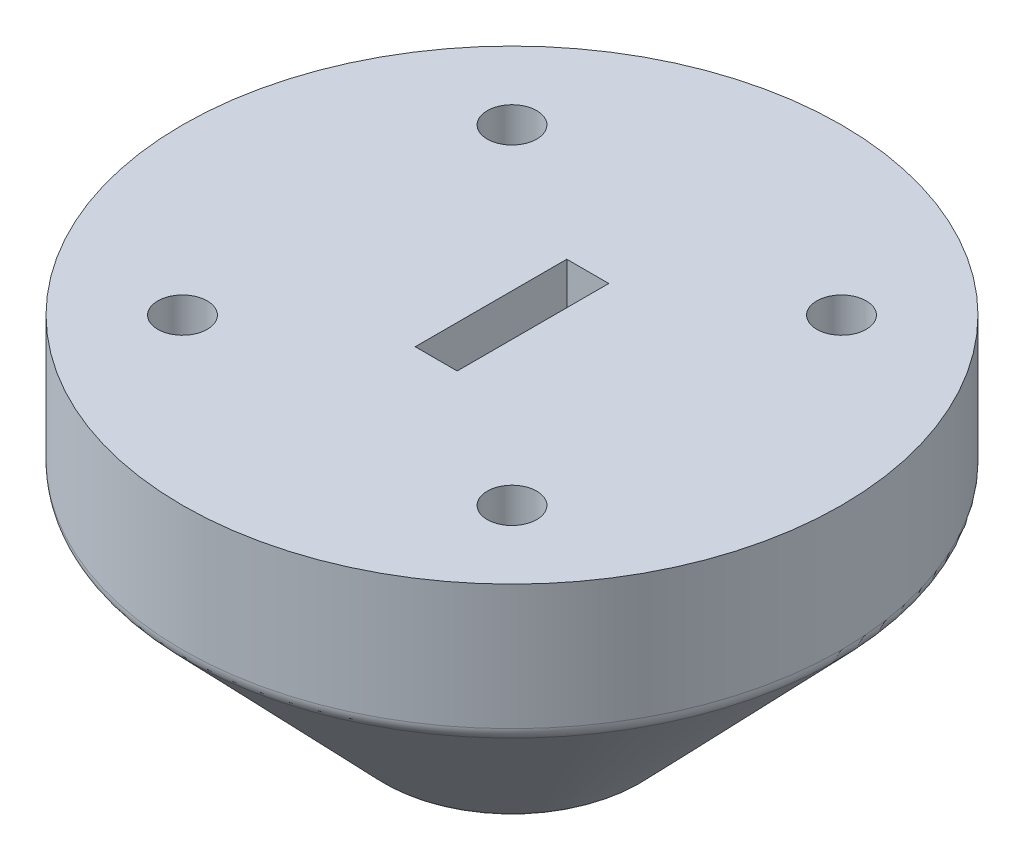
ISO-10303-21;
HEADER;
FILE_DESCRIPTION(('STEP AP214'),'2;1');
FILE_NAME('part.step','',(''),(''),'','','');
FILE_SCHEMA(('AUTOMOTIVE_DESIGN { 1 0 10303 214 1 1 1 1 }'));
ENDSEC;
DATA;
#1=APPLICATION_CONTEXT('core data for automotive mechanical design processes');
#2=APPLICATION_PROTOCOL_DEFINITION('international standard','automotive_design',2000,#1);
#3=PRODUCT_CONTEXT('',#1,'mechanical');
#4=PRODUCT('Part','Part','',(#3));
#5=PRODUCT_RELATED_PRODUCT_CATEGORY('part','',(#4));
#6=PRODUCT_DEFINITION_FORMATION('','',#4);
#7=PRODUCT_DEFINITION_CONTEXT('part definition',#1,'design');
#8=PRODUCT_DEFINITION('design','',#6,#7);
#9=PRODUCT_DEFINITION_SHAPE('','',#8);
#10=(LENGTH_UNIT() NAMED_UNIT(*) SI_UNIT(.MILLI.,.METRE.));
#11=(NAMED_UNIT(*) PLANE_ANGLE_UNIT() SI_UNIT($,.RADIAN.));
#12=(NAMED_UNIT(*) SI_UNIT($,.STERADIAN.) SOLID_ANGLE_UNIT());
#13=UNCERTAINTY_MEASURE_WITH_UNIT(LENGTH_MEASURE(1.E-05),#10,'distance_accuracy_value','');
#14=(GEOMETRIC_REPRESENTATION_CONTEXT(3) GLOBAL_UNCERTAINTY_ASSIGNED_CONTEXT((#13)) GLOBAL_UNIT_ASSIGNED_CONTEXT((#10,
#11,#12)) REPRESENTATION_CONTEXT('',''));
#15=CARTESIAN_POINT('',(0.,0.,0.));
#16=DIRECTION('',(0.,0.,1.));
#17=DIRECTION('',(1.,0.,0.));
#18=AXIS2_PLACEMENT_3D('',#15,#16,#17);
#19=CARTESIAN_POINT('',(0.,0.,-9.2));
#20=DIRECTION('',(0.,0.,-1.));
#21=DIRECTION('',(-1.,0.,0.));
#22=AXIS2_PLACEMENT_3D('',#19,#20,#21);
#23=PLANE('',#22);
#24=DIRECTION('',(0.0772683010231386,-0.997010335782432,0.));
#25=VECTOR('',#24,1.);
#26=CARTESIAN_POINT('',(-2.55,-20.,-9.2));
#27=LINE('',#26,#25);
#28=CARTESIAN_POINT('',(-2.55,-20.,-9.2));
#29=VERTEX_POINT('',#28);
#30=CARTESIAN_POINT('',(-2.23999999999999,-24.,-9.19999999999992));
#31=VERTEX_POINT('',#30);
#32=EDGE_CURVE('E263',#29,#31,#27,.T.);
#33=ORIENTED_EDGE('',*,*,#32,.T.);
#34=DIRECTION('',(1.,0.,0.));
#35=VECTOR('',#34,1.);
#36=CARTESIAN_POINT('',(0.,-24.0000000000001,-9.2));
#37=LINE('',#36,#35);
#38=CARTESIAN_POINT('',(2.24,-24.,-9.19999999999992));
#39=VERTEX_POINT('',#38);
#40=EDGE_CURVE('E137',#31,#39,#37,.T.);
#41=ORIENTED_EDGE('',*,*,#40,.T.);
#42=DIRECTION('',(0.0772683010231384,0.997010335782432,0.));
#43=VECTOR('',#42,1.);
#44=CARTESIAN_POINT('',(2.55,-20.,-9.2));
#45=LINE('',#44,#43);
#46=CARTESIAN_POINT('',(2.55,-20.,-9.2));
#47=VERTEX_POINT('',#46);
#48=EDGE_CURVE('E150',#39,#47,#45,.T.);
#49=ORIENTED_EDGE('',*,*,#48,.T.);
#50=DIRECTION('',(0.,1.,0.));
#51=VECTOR('',#50,1.);
#52=CARTESIAN_POINT('',(2.55,0.,-9.2));
#53=LINE('',#52,#51);
#54=CARTESIAN_POINT('',(2.55,0.,-9.2));
#55=VERTEX_POINT('',#54);
#56=EDGE_CURVE('E149',#47,#55,#53,.T.);
#57=ORIENTED_EDGE('',*,*,#56,.T.);
#58=DIRECTION('',(-1.,0.,0.));
#59=VECTOR('',#58,1.);
#60=CARTESIAN_POINT('',(-2.55,0.,-9.2));
#61=LINE('',#60,#59);
#62=CARTESIAN_POINT('',(-2.55,0.,-9.2));
#63=VERTEX_POINT('',#62);
#64=EDGE_CURVE('E152',#55,#63,#61,.T.);
#65=ORIENTED_EDGE('',*,*,#64,.T.);
#66=DIRECTION('',(0.,-1.,0.));
#67=VECTOR('',#66,1.);
#68=CARTESIAN_POINT('',(-2.55,0.,-9.2));
#69=LINE('',#68,#67);
#70=EDGE_CURVE('E260',#63,#29,#69,.T.);
#71=ORIENTED_EDGE('',*,*,#70,.T.);
#72=EDGE_LOOP('',(#33,#41,#49,#57,#65,#71));
#73=FACE_BOUND('',#72,.T.);
#74=ADVANCED_FACE('F32',(#73),#23,.F.);
#75=CARTESIAN_POINT('',(0.,0.,0.));
#76=DIRECTION('',(0.,1.,0.));
#77=DIRECTION('',(0.,0.,1.));
#78=AXIS2_PLACEMENT_3D('',#75,#76,#77);
#79=PLANE('',#78);
#80=CARTESIAN_POINT('',(20.,0.,20.));
#81=DIRECTION('',(0.,1.,0.));
#82=DIRECTION('',(0.,0.,1.));
#83=AXIS2_PLACEMENT_3D('',#80,#81,#82);
#84=CIRCLE('',#83,3.);
#85=CARTESIAN_POINT('',(20.,0.,23.));
#86=VERTEX_POINT('',#85);
#87=EDGE_CURVE('E186',#86,#86,#84,.T.);
#88=ORIENTED_EDGE('',*,*,#87,.F.);
#89=EDGE_LOOP('',(#88));
#90=FACE_BOUND('',#89,.T.);
#91=CARTESIAN_POINT('',(-20.,0.,-20.));
#92=DIRECTION('',(0.,1.,0.));
#93=DIRECTION('',(0.,0.,1.));
#94=AXIS2_PLACEMENT_3D('',#91,#92,#93);
#95=CIRCLE('',#94,3.);
#96=CARTESIAN_POINT('',(-20.,0.,-17.));
#97=VERTEX_POINT('',#96);
#98=EDGE_CURVE('E192',#97,#97,#95,.T.);
#99=ORIENTED_EDGE('',*,*,#98,.F.);
#100=EDGE_LOOP('',(#99));
#101=FACE_BOUND('',#100,.T.);
#102=CARTESIAN_POINT('',(-20.,0.,20.));
#103=DIRECTION('',(0.,1.,0.));
#104=DIRECTION('',(0.,0.,1.));
#105=AXIS2_PLACEMENT_3D('',#102,#103,#104);
#106=CIRCLE('',#105,3.);
#107=CARTESIAN_POINT('',(-20.,0.,23.));
#108=VERTEX_POINT('',#107);
#109=EDGE_CURVE('E198',#108,#108,#106,.T.);
#110=ORIENTED_EDGE('',*,*,#109,.F.);
#111=EDGE_LOOP('',(#110));
#112=FACE_BOUND('',#111,.T.);
#113=CARTESIAN_POINT('',(20.,0.,-20.));
#114=DIRECTION('',(0.,1.,0.));
#115=DIRECTION('',(0.,0.,1.));
#116=AXIS2_PLACEMENT_3D('',#113,#114,#115);
#117=CIRCLE('',#116,3.);
#118=CARTESIAN_POINT('',(20.,0.,-17.));
#119=VERTEX_POINT('',#118);
#120=EDGE_CURVE('E204',#119,#119,#117,.T.);
#121=ORIENTED_EDGE('',*,*,#120,.F.);
#122=EDGE_LOOP('',(#121));
#123=FACE_BOUND('',#122,.T.);
#124=CARTESIAN_POINT('',(0.,0.,0.));
#125=DIRECTION('',(0.,-1.,0.));
#126=DIRECTION('',(0.,0.,-1.));
#127=AXIS2_PLACEMENT_3D('',#124,#125,#126);
#128=CIRCLE('',#127,40.);
#129=CARTESIAN_POINT('',(0.,0.,-40.));
#130=VERTEX_POINT('',#129);
#131=EDGE_CURVE('E210',#130,#130,#128,.T.);
#132=ORIENTED_EDGE('',*,*,#131,.F.);
#133=EDGE_LOOP('',(#132));
#134=FACE_BOUND('',#133,.T.);
#135=DIRECTION('',(0.,0.,-1.));
#136=VECTOR('',#135,1.);
#137=CARTESIAN_POINT('',(2.55,0.,9.2));
#138=LINE('',#137,#136);
#139=CARTESIAN_POINT('',(2.55,0.,9.2));
#140=VERTEX_POINT('',#139);
#141=EDGE_CURVE('E178',#140,#55,#138,.T.);
#142=ORIENTED_EDGE('',*,*,#141,.F.);
#143=DIRECTION('',(-1.,0.,0.));
#144=VECTOR('',#143,1.);
#145=CARTESIAN_POINT('',(-2.55,0.,9.2));
#146=LINE('',#145,#144);
#147=CARTESIAN_POINT('',(-2.55,0.,9.2));
#148=VERTEX_POINT('',#147);
#149=EDGE_CURVE('E172',#140,#148,#146,.T.);
#150=ORIENTED_EDGE('',*,*,#149,.T.);
#151=DIRECTION('',(0.,0.,-1.));
#152=VECTOR('',#151,1.);
#153=CARTESIAN_POINT('',(-2.55,0.,9.2));
#154=LINE('',#153,#152);
#155=EDGE_CURVE('E175',#148,#63,#154,.T.);
#156=ORIENTED_EDGE('',*,*,#155,.T.);
#157=ORIENTED_EDGE('',*,*,#64,.F.);
#158=EDGE_LOOP('',(#142,#150,#156,#157));
#159=FACE_BOUND('',#158,.T.);
#160=ADVANCED_FACE('F287',(#90,#101,#112,#123,#134,#159),#79,.T.);
#161=CARTESIAN_POINT('',(0.,-42.,0.));
#162=DIRECTION('',(0.,-1.,0.));
#163=DIRECTION('',(0.,0.,-1.));
#164=AXIS2_PLACEMENT_3D('',#161,#162,#163);
#165=CYLINDRICAL_SURFACE('',#164,40.);
#166=CARTESIAN_POINT('',(0.,-15.1944497925006,0.));
#167=DIRECTION('',(0.,1.,0.));
#168=DIRECTION('',(0.,0.,1.));
#169=AXIS2_PLACEMENT_3D('',#166,#167,#168);
#170=CIRCLE('',#169,40.);
#171=CARTESIAN_POINT('',(0.,-15.1944497925006,40.));
#172=VERTEX_POINT('',#171);
#173=EDGE_CURVE('E222',#172,#172,#170,.T.);
#174=ORIENTED_EDGE('',*,*,#173,.T.);
#175=EDGE_LOOP('',(#174));
#176=FACE_BOUND('',#175,.T.);
#177=ORIENTED_EDGE('',*,*,#131,.T.);
#178=EDGE_LOOP('',(#177));
#179=FACE_BOUND('',#178,.T.);
#180=ADVANCED_FACE('F313',(#176,#179),#165,.T.);
#181=CARTESIAN_POINT('',(0.,-42.,0.));
#182=DIRECTION('',(0.,1.,0.));
#183=DIRECTION('',(0.,0.,1.));
#184=AXIS2_PLACEMENT_3D('',#181,#182,#183);
#185=CONICAL_SURFACE('',#184,15.,0.765792832540243);
#186=CARTESIAN_POINT('',(0.,-16.5806672250041,0.));
#187=DIRECTION('',(0.,-1.,0.));
#188=DIRECTION('',(0.,0.,-1.));
#189=AXIS2_PLACEMENT_3D('',#186,#187,#188);
#190=CIRCLE('',#189,39.4416661298037);
#191=CARTESIAN_POINT('',(0.,-16.5806672250041,-39.4416661298037));
#192=VERTEX_POINT('',#191);
#193=EDGE_CURVE('E219',#192,#192,#190,.T.);
#194=ORIENTED_EDGE('',*,*,#193,.T.);
#195=EDGE_LOOP('',(#194));
#196=FACE_BOUND('',#195,.T.);
#197=CARTESIAN_POINT('',(0.,-41.3862174325036,0.));
#198=DIRECTION('',(0.,-1.,0.));
#199=DIRECTION('',(0.,0.,-1.));
#200=AXIS2_PLACEMENT_3D('',#197,#198,#199);
#201=CIRCLE('',#200,15.5901755456696);
#202=CARTESIAN_POINT('',(0.,-41.3862174325036,-15.5901755456696));
#203=VERTEX_POINT('',#202);
#204=EDGE_CURVE('E216',#203,#203,#201,.F.);
#205=ORIENTED_EDGE('',*,*,#204,.T.);
#206=EDGE_LOOP('',(#205));
#207=FACE_BOUND('',#206,.T.);
#208=ADVANCED_FACE('F404',(#196,#207),#185,.T.);
#209=CARTESIAN_POINT('',(15.,-42.,0.));
#210=DIRECTION('',(0.,-1.,0.));
#211=DIRECTION('',(0.,0.,-1.));
#212=AXIS2_PLACEMENT_3D('',#209,#210,#211);
#213=PLANE('',#212);
#214=CARTESIAN_POINT('',(0.,-42.,0.));
#215=DIRECTION('',(0.,-1.,0.));
#216=DIRECTION('',(0.,0.,-1.));
#217=AXIS2_PLACEMENT_3D('',#214,#215,#216);
#218=CIRCLE('',#217,14.1485094158659);
#219=CARTESIAN_POINT('',(0.,-42.,-14.1485094158659));
#220=VERTEX_POINT('',#219);
#221=EDGE_CURVE('E213',#220,#220,#218,.T.);
#222=ORIENTED_EDGE('',*,*,#221,.T.);
#223=EDGE_LOOP('',(#222));
#224=FACE_BOUND('',#223,.T.);
#225=ADVANCED_FACE('F397',(#224),#213,.T.);
#226=CARTESIAN_POINT('',(20.,-12.,-20.));
#227=DIRECTION('',(0.,1.,0.));
#228=DIRECTION('',(0.,0.,1.));
#229=AXIS2_PLACEMENT_3D('',#226,#227,#228);
#230=CONICAL_SURFACE('',#229,3.,0.785398163397447);
#231=CARTESIAN_POINT('',(20.,-15.,-20.));
#232=VERTEX_POINT('',#231);
#233=VERTEX_LOOP('',#232);
#234=FACE_BOUND('',#233,.T.);
#235=CARTESIAN_POINT('',(20.,-12.,-20.));
#236=DIRECTION('',(0.,1.,0.));
#237=DIRECTION('',(0.,0.,1.));
#238=AXIS2_PLACEMENT_3D('',#235,#236,#237);
#239=CIRCLE('',#238,3.);
#240=CARTESIAN_POINT('',(20.,-12.,-17.));
#241=VERTEX_POINT('',#240);
#242=EDGE_CURVE('E207',#241,#241,#239,.T.);
#243=ORIENTED_EDGE('',*,*,#242,.T.);
#244=EDGE_LOOP('',(#243));
#245=FACE_BOUND('',#244,.T.);
#246=ADVANCED_FACE('F420',(#234,#245),#230,.F.);
#247=CARTESIAN_POINT('',(20.,0.,-20.));
#248=DIRECTION('',(0.,1.,0.));
#249=DIRECTION('',(0.,0.,1.));
#250=AXIS2_PLACEMENT_3D('',#247,#248,#249);
#251=CYLINDRICAL_SURFACE('',#250,3.);
#252=ORIENTED_EDGE('',*,*,#242,.F.);
#253=EDGE_LOOP('',(#252));
#254=FACE_BOUND('',#253,.T.);
#255=ORIENTED_EDGE('',*,*,#120,.T.);
#256=EDGE_LOOP('',(#255));
#257=FACE_BOUND('',#256,.T.);
#258=ADVANCED_FACE('F426',(#254,#257),#251,.F.);
#259=CARTESIAN_POINT('',(-20.,-12.,20.));
#260=DIRECTION('',(0.,1.,0.));
#261=DIRECTION('',(0.,0.,1.));
#262=AXIS2_PLACEMENT_3D('',#259,#260,#261);
#263=CONICAL_SURFACE('',#262,3.,0.785398163397447);
#264=CARTESIAN_POINT('',(-20.,-15.,20.));
#265=VERTEX_POINT('',#264);
#266=VERTEX_LOOP('',#265);
#267=FACE_BOUND('',#266,.T.);
#268=CARTESIAN_POINT('',(-20.,-12.,20.));
#269=DIRECTION('',(0.,1.,0.));
#270=DIRECTION('',(0.,0.,1.));
#271=AXIS2_PLACEMENT_3D('',#268,#269,#270);
#272=CIRCLE('',#271,3.);
#273=CARTESIAN_POINT('',(-20.,-12.,23.));
#274=VERTEX_POINT('',#273);
#275=EDGE_CURVE('E201',#274,#274,#272,.T.);
#276=ORIENTED_EDGE('',*,*,#275,.T.);
#277=EDGE_LOOP('',(#276));
#278=FACE_BOUND('',#277,.T.);
#279=ADVANCED_FACE('F434',(#267,#278),#263,.F.);
#280=CARTESIAN_POINT('',(-20.,0.,20.));
#281=DIRECTION('',(0.,1.,0.));
#282=DIRECTION('',(0.,0.,1.));
#283=AXIS2_PLACEMENT_3D('',#280,#281,#282);
#284=CYLINDRICAL_SURFACE('',#283,3.);
#285=ORIENTED_EDGE('',*,*,#275,.F.);
#286=EDGE_LOOP('',(#285));
#287=FACE_BOUND('',#286,.T.);
#288=ORIENTED_EDGE('',*,*,#109,.T.);
#289=EDGE_LOOP('',(#288));
#290=FACE_BOUND('',#289,.T.);
#291=ADVANCED_FACE('F442',(#287,#290),#284,.F.);
#292=CARTESIAN_POINT('',(-20.,-12.,-20.));
#293=DIRECTION('',(0.,1.,0.));
#294=DIRECTION('',(0.,0.,1.));
#295=AXIS2_PLACEMENT_3D('',#292,#293,#294);
#296=CONICAL_SURFACE('',#295,3.,0.785398163397447);
#297=CARTESIAN_POINT('',(-20.,-15.,-20.));
#298=VERTEX_POINT('',#297);
#299=VERTEX_LOOP('',#298);
#300=FACE_BOUND('',#299,.T.);
#301=CARTESIAN_POINT('',(-20.,-12.,-20.));
#302=DIRECTION('',(0.,1.,0.));
#303=DIRECTION('',(0.,0.,1.));
#304=AXIS2_PLACEMENT_3D('',#301,#302,#303);
#305=CIRCLE('',#304,3.);
#306=CARTESIAN_POINT('',(-20.,-12.,-17.));
#307=VERTEX_POINT('',#306);
#308=EDGE_CURVE('E195',#307,#307,#305,.T.);
#309=ORIENTED_EDGE('',*,*,#308,.T.);
#310=EDGE_LOOP('',(#309));
#311=FACE_BOUND('',#310,.T.);
#312=ADVANCED_FACE('F450',(#300,#311),#296,.F.);
#313=CARTESIAN_POINT('',(-20.,0.,-20.));
#314=DIRECTION('',(0.,1.,0.));
#315=DIRECTION('',(0.,0.,1.));
#316=AXIS2_PLACEMENT_3D('',#313,#314,#315);
#317=CYLINDRICAL_SURFACE('',#316,3.);
#318=ORIENTED_EDGE('',*,*,#308,.F.);
#319=EDGE_LOOP('',(#318));
#320=FACE_BOUND('',#319,.T.);
#321=ORIENTED_EDGE('',*,*,#98,.T.);
#322=EDGE_LOOP('',(#321));
#323=FACE_BOUND('',#322,.T.);
#324=ADVANCED_FACE('F458',(#320,#323),#317,.F.);
#325=CARTESIAN_POINT('',(20.,-12.,20.));
#326=DIRECTION('',(0.,1.,0.));
#327=DIRECTION('',(0.,0.,1.));
#328=AXIS2_PLACEMENT_3D('',#325,#326,#327);
#329=CONICAL_SURFACE('',#328,3.,0.785398163397447);
#330=CARTESIAN_POINT('',(20.,-15.,20.));
#331=VERTEX_POINT('',#330);
#332=VERTEX_LOOP('',#331);
#333=FACE_BOUND('',#332,.T.);
#334=CARTESIAN_POINT('',(20.,-12.,20.));
#335=DIRECTION('',(0.,1.,0.));
#336=DIRECTION('',(0.,0.,1.));
#337=AXIS2_PLACEMENT_3D('',#334,#335,#336);
#338=CIRCLE('',#337,3.);
#339=CARTESIAN_POINT('',(20.,-12.,23.));
#340=VERTEX_POINT('',#339);
#341=EDGE_CURVE('E189',#340,#340,#338,.T.);
#342=ORIENTED_EDGE('',*,*,#341,.T.);
#343=EDGE_LOOP('',(#342));
#344=FACE_BOUND('',#343,.T.);
#345=ADVANCED_FACE('F466',(#333,#344),#329,.F.);
#346=CARTESIAN_POINT('',(20.,0.,20.));
#347=DIRECTION('',(0.,1.,0.));
#348=DIRECTION('',(0.,0.,1.));
#349=AXIS2_PLACEMENT_3D('',#346,#347,#348);
#350=CYLINDRICAL_SURFACE('',#349,3.);
#351=ORIENTED_EDGE('',*,*,#341,.F.);
#352=EDGE_LOOP('',(#351));
#353=FACE_BOUND('',#352,.T.);
#354=ORIENTED_EDGE('',*,*,#87,.T.);
#355=EDGE_LOOP('',(#354));
#356=FACE_BOUND('',#355,.T.);
#357=ADVANCED_FACE('F474',(#353,#356),#350,.F.);
#358=CARTESIAN_POINT('',(-2.55,0.,9.2));
#359=DIRECTION('',(1.,0.,0.));
#360=DIRECTION('',(0.,1.,0.));
#361=AXIS2_PLACEMENT_3D('',#358,#359,#360);
#362=PLANE('',#361);
#363=ORIENTED_EDGE('',*,*,#155,.F.);
#364=DIRECTION('',(0.,-1.,0.));
#365=VECTOR('',#364,1.);
#366=CARTESIAN_POINT('',(-2.55,0.,9.2));
#367=LINE('',#366,#365);
#368=CARTESIAN_POINT('',(-2.55,-20.,9.2));
#369=VERTEX_POINT('',#368);
#370=EDGE_CURVE('E160',#148,#369,#367,.T.);
#371=ORIENTED_EDGE('',*,*,#370,.T.);
#372=DIRECTION('',(0.,0.,-1.));
#373=VECTOR('',#372,1.);
#374=CARTESIAN_POINT('',(-2.55,-20.,9.2));
#375=LINE('',#374,#373);
#376=EDGE_CURVE('E184',#369,#29,#375,.T.);
#377=ORIENTED_EDGE('',*,*,#376,.T.);
#378=ORIENTED_EDGE('',*,*,#70,.F.);
#379=EDGE_LOOP('',(#363,#371,#377,#378));
#380=FACE_BOUND('',#379,.T.);
#381=ADVANCED_FACE('F283',(#380),#362,.T.);
#382=CARTESIAN_POINT('',(-2.55,-20.,9.2));
#383=DIRECTION('',(0.997010335782432,0.0772683010231386,0.));
#384=DIRECTION('',(-0.0772683010231386,0.997010335782432,0.));
#385=AXIS2_PLACEMENT_3D('',#382,#383,#384);
#386=PLANE('',#385);
#387=DIRECTION('',(0.054718673627955,-0.706047401651031,-0.706047401651068));
#388=VECTOR('',#387,1.);
#389=CARTESIAN_POINT('',(-2.87452540962919,-15.8125753596234,4.98742464037732));
#390=LINE('',#389,#388);
#391=CARTESIAN_POINT('',(-1.95269922445803,-27.7071067811866,-6.90710678118657));
#392=VERTEX_POINT('',#391);
#393=CARTESIAN_POINT('',(-1.77499999999999,-30.0000000000001,-9.2));
#394=VERTEX_POINT('',#393);
#395=EDGE_CURVE('E133',#392,#394,#390,.T.);
#396=ORIENTED_EDGE('',*,*,#395,.F.);
#397=CARTESIAN_POINT('',(-2.00749999999999,-27.,-7.6142135623731));
#398=DIRECTION('',(0.997010335782432,0.0772683010231386,0.));
#399=DIRECTION('',(0.0772683010231386,-0.997010335782432,0.));
#400=AXIS2_PLACEMENT_3D('',#397,#398,#399);
#401=ELLIPSE('',#400,1.00299862911173,1.);
#402=CARTESIAN_POINT('',(-2.06230077554195,-26.2928932188135,-6.90710678118653));
#403=VERTEX_POINT('',#402);
#404=EDGE_CURVE('E11',#392,#403,#401,.F.);
#405=ORIENTED_EDGE('',*,*,#404,.T.);
#406=DIRECTION('',(0.0547186736279579,-0.706047401651069,0.70604740165103));
#407=VECTOR('',#406,1.);
#408=CARTESIAN_POINT('',(-1.68459890765545,-31.1664657076715,-2.03353429232882));
#409=LINE('',#408,#407);
#410=EDGE_CURVE('E144',#31,#403,#409,.T.);
#411=ORIENTED_EDGE('',*,*,#410,.F.);
#412=ORIENTED_EDGE('',*,*,#32,.F.);
#413=ORIENTED_EDGE('',*,*,#376,.F.);
#414=DIRECTION('',(0.0772683010231386,-0.997010335782432,0.));
#415=VECTOR('',#414,1.);
#416=CARTESIAN_POINT('',(-2.55,-20.,9.2));
#417=LINE('',#416,#415);
#418=CARTESIAN_POINT('',(-1.0715117066707,-39.0772683010231,9.2));
#419=VERTEX_POINT('',#418);
#420=EDGE_CURVE('E163',#369,#419,#417,.T.);
#421=ORIENTED_EDGE('',*,*,#420,.T.);
#422=DIRECTION('',(0.,0.,-1.));
#423=VECTOR('',#422,1.);
#424=CARTESIAN_POINT('',(-1.0715117066707,-39.0772683010231,-9.2));
#425=LINE('',#424,#423);
#426=CARTESIAN_POINT('',(-1.0715117066707,-39.0772683010231,-9.2));
#427=VERTEX_POINT('',#426);
#428=EDGE_CURVE('E234',#419,#427,#425,.T.);
#429=ORIENTED_EDGE('',*,*,#428,.T.);
#430=EDGE_CURVE('E262',#394,#427,#27,.T.);
#431=ORIENTED_EDGE('',*,*,#430,.F.);
#432=EDGE_LOOP('',(#396,#405,#411,#412,#413,#421,#429,#431));
#433=FACE_BOUND('',#432,.T.);
#434=ADVANCED_FACE('F275',(#433),#386,.T.);
#435=CARTESIAN_POINT('',(1.00000000000001,-40.,9.2));
#436=DIRECTION('',(0.,1.,0.));
#437=DIRECTION('',(0.,0.,1.));
#438=AXIS2_PLACEMENT_3D('',#435,#436,#437);
#439=PLANE('',#438);
#440=DIRECTION('',(1.,0.,0.));
#441=VECTOR('',#440,1.);
#442=CARTESIAN_POINT('',(1.00000000000001,-40.,-9.2));
#443=LINE('',#442,#441);
#444=CARTESIAN_POINT('',(-0.07450137088827,-40.,-9.2));
#445=VERTEX_POINT('',#444);
#446=CARTESIAN_POINT('',(0.0745013708882798,-40.,-9.2));
#447=VERTEX_POINT('',#446);
#448=EDGE_CURVE('E154',#445,#447,#443,.T.);
#449=ORIENTED_EDGE('',*,*,#448,.F.);
#450=DIRECTION('',(0.,0.,-1.));
#451=VECTOR('',#450,1.);
#452=CARTESIAN_POINT('',(-0.07450137088827,-40.,9.2));
#453=LINE('',#452,#451);
#454=CARTESIAN_POINT('',(-0.07450137088827,-40.,9.2));
#455=VERTEX_POINT('',#454);
#456=EDGE_CURVE('E239',#445,#455,#453,.F.);
#457=ORIENTED_EDGE('',*,*,#456,.T.);
#458=DIRECTION('',(1.,0.,0.));
#459=VECTOR('',#458,1.);
#460=CARTESIAN_POINT('',(1.00000000000001,-40.,9.2));
#461=LINE('',#460,#459);
#462=CARTESIAN_POINT('',(0.0745013708882798,-40.,9.2));
#463=VERTEX_POINT('',#462);
#464=EDGE_CURVE('E166',#455,#463,#461,.T.);
#465=ORIENTED_EDGE('',*,*,#464,.T.);
#466=DIRECTION('',(0.,0.,-1.));
#467=VECTOR('',#466,1.);
#468=CARTESIAN_POINT('',(0.0745013708882798,-40.,-9.2));
#469=LINE('',#468,#467);
#470=EDGE_CURVE('E225',#463,#447,#469,.T.);
#471=ORIENTED_EDGE('',*,*,#470,.T.);
#472=EDGE_LOOP('',(#449,#457,#465,#471));
#473=FACE_BOUND('',#472,.T.);
#474=ADVANCED_FACE('F299',(#473),#439,.T.);
#475=CARTESIAN_POINT('',(2.55,-20.,9.2));
#476=DIRECTION('',(-0.997010335782432,0.0772683010231384,0.));
#477=DIRECTION('',(-0.0772683010231384,-0.997010335782432,0.));
#478=AXIS2_PLACEMENT_3D('',#475,#476,#477);
#479=PLANE('',#478);
#480=DIRECTION('',(0.0547186736279548,0.706047401651031,0.706047401651068));
#481=VECTOR('',#480,1.);
#482=CARTESIAN_POINT('',(2.87452540962919,-15.8125753596234,4.98742464037732));
#483=LINE('',#482,#481);
#484=CARTESIAN_POINT('',(1.775,-30.,-9.20000000000008));
#485=VERTEX_POINT('',#484);
#486=CARTESIAN_POINT('',(1.95269922445804,-27.7071067811866,-6.90710678118657));
#487=VERTEX_POINT('',#486);
#488=EDGE_CURVE('E132',#485,#487,#483,.T.);
#489=ORIENTED_EDGE('',*,*,#488,.F.);
#490=CARTESIAN_POINT('',(1.07151170667071,-39.0772683010231,-9.2));
#491=VERTEX_POINT('',#490);
#492=EDGE_CURVE('E142',#491,#485,#45,.T.);
#493=ORIENTED_EDGE('',*,*,#492,.F.);
#494=DIRECTION('',(0.,0.,-1.));
#495=VECTOR('',#494,1.);
#496=CARTESIAN_POINT('',(1.07151170667071,-39.0772683010231,9.2));
#497=LINE('',#496,#495);
#498=CARTESIAN_POINT('',(1.07151170667071,-39.0772683010231,9.2));
#499=VERTEX_POINT('',#498);
#500=EDGE_CURVE('E229',#491,#499,#497,.F.);
#501=ORIENTED_EDGE('',*,*,#500,.T.);
#502=DIRECTION('',(0.0772683010231384,0.997010335782432,0.));
#503=VECTOR('',#502,1.);
#504=CARTESIAN_POINT('',(2.55,-20.,9.2));
#505=LINE('',#504,#503);
#506=CARTESIAN_POINT('',(2.55,-20.,9.2));
#507=VERTEX_POINT('',#506);
#508=EDGE_CURVE('E168',#499,#507,#505,.T.);
#509=ORIENTED_EDGE('',*,*,#508,.T.);
#510=DIRECTION('',(0.,0.,-1.));
#511=VECTOR('',#510,1.);
#512=CARTESIAN_POINT('',(2.55,-20.,9.2));
#513=LINE('',#512,#511);
#514=EDGE_CURVE('E181',#507,#47,#513,.T.);
#515=ORIENTED_EDGE('',*,*,#514,.T.);
#516=ORIENTED_EDGE('',*,*,#48,.F.);
#517=DIRECTION('',(0.0547186736279578,0.706047401651069,-0.70604740165103));
#518=VECTOR('',#517,1.);
#519=CARTESIAN_POINT('',(1.68459890765546,-31.1664657076715,-2.03353429232881));
#520=LINE('',#519,#518);
#521=CARTESIAN_POINT('',(2.06230077554196,-26.2928932188135,-6.90710678118653));
#522=VERTEX_POINT('',#521);
#523=EDGE_CURVE('E251',#522,#39,#520,.T.);
#524=ORIENTED_EDGE('',*,*,#523,.F.);
#525=CARTESIAN_POINT('',(2.0075,-27.,-7.6142135623731));
#526=DIRECTION('',(-0.997010335782432,0.0772683010231384,0.));
#527=DIRECTION('',(0.0772683010231384,0.997010335782432,0.));
#528=AXIS2_PLACEMENT_3D('',#525,#526,#527);
#529=ELLIPSE('',#528,1.00299862911173,1.);
#530=EDGE_CURVE('E40',#522,#487,#529,.F.);
#531=ORIENTED_EDGE('',*,*,#530,.T.);
#532=EDGE_LOOP('',(#489,#493,#501,#509,#515,#516,#524,#531));
#533=FACE_BOUND('',#532,.T.);
#534=ADVANCED_FACE('F141',(#533),#479,.T.);
#535=CARTESIAN_POINT('',(2.55,0.,9.2));
#536=DIRECTION('',(-1.,0.,0.));
#537=DIRECTION('',(0.,-1.,0.));
#538=AXIS2_PLACEMENT_3D('',#535,#536,#537);
#539=PLANE('',#538);
#540=ORIENTED_EDGE('',*,*,#514,.F.);
#541=DIRECTION('',(0.,1.,0.));
#542=VECTOR('',#541,1.);
#543=CARTESIAN_POINT('',(2.55,0.,9.2));
#544=LINE('',#543,#542);
#545=EDGE_CURVE('E170',#507,#140,#544,.T.);
#546=ORIENTED_EDGE('',*,*,#545,.T.);
#547=ORIENTED_EDGE('',*,*,#141,.T.);
#548=ORIENTED_EDGE('',*,*,#56,.F.);
#549=EDGE_LOOP('',(#540,#546,#547,#548));
#550=FACE_BOUND('',#549,.T.);
#551=ADVANCED_FACE('F293',(#550),#539,.T.);
#552=CARTESIAN_POINT('',(0.,0.,9.2));
#553=DIRECTION('',(0.,0.,-1.));
#554=DIRECTION('',(-1.,0.,0.));
#555=AXIS2_PLACEMENT_3D('',#552,#553,#554);
#556=PLANE('',#555);
#557=ORIENTED_EDGE('',*,*,#464,.F.);
#558=CARTESIAN_POINT('',(-0.07450137088827,-39.,9.2));
#559=DIRECTION('',(0.,0.,-1.));
#560=DIRECTION('',(-1.,0.,0.));
#561=AXIS2_PLACEMENT_3D('',#558,#559,#560);
#562=CIRCLE('',#561,1.);
#563=EDGE_CURVE('E138',#455,#419,#562,.T.);
#564=ORIENTED_EDGE('',*,*,#563,.T.);
#565=ORIENTED_EDGE('',*,*,#420,.F.);
#566=ORIENTED_EDGE('',*,*,#370,.F.);
#567=ORIENTED_EDGE('',*,*,#149,.F.);
#568=ORIENTED_EDGE('',*,*,#545,.F.);
#569=ORIENTED_EDGE('',*,*,#508,.F.);
#570=CARTESIAN_POINT('',(0.0745013708882798,-39.,9.2));
#571=DIRECTION('',(0.,0.,-1.));
#572=DIRECTION('',(-1.,0.,0.));
#573=AXIS2_PLACEMENT_3D('',#570,#571,#572);
#574=CIRCLE('',#573,1.);
#575=EDGE_CURVE('E231',#499,#463,#574,.T.);
#576=ORIENTED_EDGE('',*,*,#575,.T.);
#577=EDGE_LOOP('',(#557,#564,#565,#566,#567,#568,#569,#576));
#578=FACE_BOUND('',#577,.T.);
#579=ADVANCED_FACE('F280',(#578),#556,.T.);
#580=ORIENTED_EDGE('',*,*,#492,.T.);
#581=DIRECTION('',(-1.,0.,0.));
#582=VECTOR('',#581,1.);
#583=CARTESIAN_POINT('',(0.,-30.0000000000001,-9.2));
#584=LINE('',#583,#582);
#585=EDGE_CURVE('E130',#485,#394,#584,.T.);
#586=ORIENTED_EDGE('',*,*,#585,.T.);
#587=ORIENTED_EDGE('',*,*,#430,.T.);
#588=CARTESIAN_POINT('',(-0.07450137088827,-39.,-9.2));
#589=DIRECTION('',(0.,0.,-1.));
#590=DIRECTION('',(-1.,0.,0.));
#591=AXIS2_PLACEMENT_3D('',#588,#589,#590);
#592=CIRCLE('',#591,1.);
#593=EDGE_CURVE('E237',#427,#445,#592,.F.);
#594=ORIENTED_EDGE('',*,*,#593,.T.);
#595=ORIENTED_EDGE('',*,*,#448,.T.);
#596=CARTESIAN_POINT('',(0.0745013708882798,-39.,-9.2));
#597=DIRECTION('',(0.,0.,-1.));
#598=DIRECTION('',(-1.,0.,0.));
#599=AXIS2_PLACEMENT_3D('',#596,#597,#598);
#600=CIRCLE('',#599,1.);
#601=EDGE_CURVE('E148',#447,#491,#600,.F.);
#602=ORIENTED_EDGE('',*,*,#601,.T.);
#603=EDGE_LOOP('',(#580,#586,#587,#594,#595,#602));
#604=FACE_BOUND('',#603,.T.);
#605=ADVANCED_FACE('F146',(#604),#23,.F.);
#606=CARTESIAN_POINT('',(0.,-40.,0.));
#607=DIRECTION('',(0.,-1.,0.));
#608=DIRECTION('',(0.,0.,-1.));
#609=AXIS2_PLACEMENT_3D('',#606,#607,#608);
#610=TOROIDAL_SURFACE('',#609,14.1485094158659,2.);
#611=ORIENTED_EDGE('',*,*,#204,.F.);
#612=EDGE_LOOP('',(#611));
#613=FACE_BOUND('',#612,.T.);
#614=ORIENTED_EDGE('',*,*,#221,.F.);
#615=EDGE_LOOP('',(#614));
#616=FACE_BOUND('',#615,.T.);
#617=ADVANCED_FACE('F319',(#613,#616),#610,.T.);
#618=CARTESIAN_POINT('',(0.,-15.1944497925006,0.));
#619=DIRECTION('',(0.,1.,0.));
#620=DIRECTION('',(0.,0.,1.));
#621=AXIS2_PLACEMENT_3D('',#618,#619,#620);
#622=TOROIDAL_SURFACE('',#621,38.,2.);
#623=ORIENTED_EDGE('',*,*,#173,.F.);
#624=EDGE_LOOP('',(#623));
#625=FACE_BOUND('',#624,.T.);
#626=ORIENTED_EDGE('',*,*,#193,.F.);
#627=EDGE_LOOP('',(#626));
#628=FACE_BOUND('',#627,.T.);
#629=ADVANCED_FACE('F324',(#625,#628),#622,.T.);
#630=CARTESIAN_POINT('',(0.0745013708882798,-39.,9.2));
#631=DIRECTION('',(0.,0.,1.));
#632=DIRECTION('',(1.,0.,0.));
#633=AXIS2_PLACEMENT_3D('',#630,#631,#632);
#634=CYLINDRICAL_SURFACE('',#633,1.);
#635=ORIENTED_EDGE('',*,*,#575,.F.);
#636=ORIENTED_EDGE('',*,*,#500,.F.);
#637=ORIENTED_EDGE('',*,*,#601,.F.);
#638=ORIENTED_EDGE('',*,*,#470,.F.);
#639=EDGE_LOOP('',(#635,#636,#637,#638));
#640=FACE_BOUND('',#639,.T.);
#641=ADVANCED_FACE('F296',(#640),#634,.F.);
#642=CARTESIAN_POINT('',(-0.07450137088827,-39.,9.2));
#643=DIRECTION('',(0.,0.,1.));
#644=DIRECTION('',(1.,0.,0.));
#645=AXIS2_PLACEMENT_3D('',#642,#643,#644);
#646=CYLINDRICAL_SURFACE('',#645,1.);
#647=ORIENTED_EDGE('',*,*,#563,.F.);
#648=ORIENTED_EDGE('',*,*,#456,.F.);
#649=ORIENTED_EDGE('',*,*,#593,.F.);
#650=ORIENTED_EDGE('',*,*,#428,.F.);
#651=EDGE_LOOP('',(#647,#648,#649,#650));
#652=FACE_BOUND('',#651,.T.);
#653=ADVANCED_FACE('F274',(#652),#646,.F.);
#654=CARTESIAN_POINT('',(-10.,-27.0000000000001,-6.2));
#655=DIRECTION('',(0.,-0.707106781186566,0.707106781186529));
#656=DIRECTION('',(0.,-0.707106781186529,-0.707106781186566));
#657=AXIS2_PLACEMENT_3D('',#654,#655,#656);
#658=PLANE('',#657);
#659=ORIENTED_EDGE('',*,*,#488,.T.);
#660=DIRECTION('',(1.,0.,0.));
#661=VECTOR('',#660,1.);
#662=CARTESIAN_POINT('',(-10.,-27.7071067811866,-6.90710678118657));
#663=LINE('',#662,#661);
#664=EDGE_CURVE('E53',#487,#392,#663,.F.);
#665=ORIENTED_EDGE('',*,*,#664,.T.);
#666=ORIENTED_EDGE('',*,*,#395,.T.);
#667=ORIENTED_EDGE('',*,*,#585,.F.);
#668=EDGE_LOOP('',(#659,#665,#666,#667));
#669=FACE_BOUND('',#668,.T.);
#670=ADVANCED_FACE('F131',(#669),#658,.T.);
#671=CARTESIAN_POINT('',(-10.,-24.,-9.19999999999992));
#672=DIRECTION('',(0.,0.707106781186528,0.707106781186567));
#673=DIRECTION('',(0.,-0.707106781186567,0.707106781186528));
#674=AXIS2_PLACEMENT_3D('',#671,#672,#673);
#675=PLANE('',#674);
#676=ORIENTED_EDGE('',*,*,#410,.T.);
#677=DIRECTION('',(1.,0.,0.));
#678=VECTOR('',#677,1.);
#679=CARTESIAN_POINT('',(-10.,-26.2928932188135,-6.90710678118653));
#680=LINE('',#679,#678);
#681=EDGE_CURVE('E244',#403,#522,#680,.T.);
#682=ORIENTED_EDGE('',*,*,#681,.T.);
#683=ORIENTED_EDGE('',*,*,#523,.T.);
#684=ORIENTED_EDGE('',*,*,#40,.F.);
#685=EDGE_LOOP('',(#676,#682,#683,#684));
#686=FACE_BOUND('',#685,.T.);
#687=ADVANCED_FACE('F250',(#686),#675,.T.);
#688=CARTESIAN_POINT('',(-10.,-27.,-7.6142135623731));
#689=DIRECTION('',(1.,0.,0.));
#690=DIRECTION('',(0.,0.,-1.));
#691=AXIS2_PLACEMENT_3D('',#688,#689,#690);
#692=CYLINDRICAL_SURFACE('',#691,1.);
#693=ORIENTED_EDGE('',*,*,#404,.F.);
#694=ORIENTED_EDGE('',*,*,#664,.F.);
#695=ORIENTED_EDGE('',*,*,#530,.F.);
#696=ORIENTED_EDGE('',*,*,#681,.F.);
#697=EDGE_LOOP('',(#693,#694,#695,#696));
#698=FACE_BOUND('',#697,.T.);
#699=ADVANCED_FACE('F34',(#698),#692,.T.);
#700=CLOSED_SHELL('',(#74,#160,#180,#208,#225,#246,#258,#279,#291,#312,#324,#345,#357,#381,#434,
#474,#534,#551,#579,#605,#617,#629,#641,#653,#670,#687,#699));
#701=MANIFOLD_SOLID_BREP('B2',#700);
#702=ADVANCED_BREP_SHAPE_REPRESENTATION('',(#18,#701),#14);
#703=SHAPE_DEFINITION_REPRESENTATION(#9,#702);
ENDSEC;
END-ISO-10303-21;
